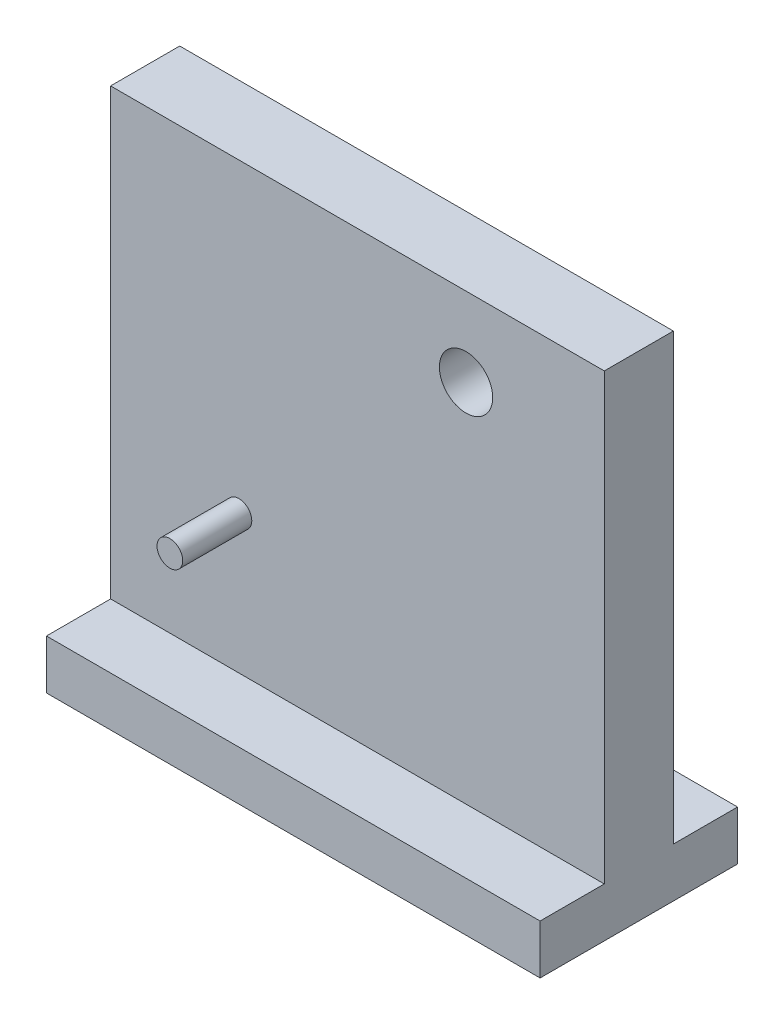
ISO-10303-21;
HEADER;
FILE_DESCRIPTION(('STEP AP214'),'2;1');
FILE_NAME('part.step','',(''),(''),'','','');
FILE_SCHEMA(('AUTOMOTIVE_DESIGN { 1 0 10303 214 1 1 1 1 }'));
ENDSEC;
DATA;
#1=APPLICATION_CONTEXT('core data for automotive mechanical design processes');
#2=APPLICATION_PROTOCOL_DEFINITION('international standard','automotive_design',2000,#1);
#3=PRODUCT_CONTEXT('',#1,'mechanical');
#4=PRODUCT('Part','Part','',(#3));
#5=PRODUCT_RELATED_PRODUCT_CATEGORY('part','',(#4));
#6=PRODUCT_DEFINITION_FORMATION('','',#4);
#7=PRODUCT_DEFINITION_CONTEXT('part definition',#1,'design');
#8=PRODUCT_DEFINITION('design','',#6,#7);
#9=PRODUCT_DEFINITION_SHAPE('','',#8);
#10=(LENGTH_UNIT() NAMED_UNIT(*) SI_UNIT(.MILLI.,.METRE.));
#11=(NAMED_UNIT(*) PLANE_ANGLE_UNIT() SI_UNIT($,.RADIAN.));
#12=(NAMED_UNIT(*) SI_UNIT($,.STERADIAN.) SOLID_ANGLE_UNIT());
#13=UNCERTAINTY_MEASURE_WITH_UNIT(LENGTH_MEASURE(1.E-05),#10,'distance_accuracy_value','');
#14=(GEOMETRIC_REPRESENTATION_CONTEXT(3) GLOBAL_UNCERTAINTY_ASSIGNED_CONTEXT((#13)) GLOBAL_UNIT_ASSIGNED_CONTEXT((#10,
#11,#12)) REPRESENTATION_CONTEXT('',''));
#15=CARTESIAN_POINT('',(0.,0.,0.));
#16=DIRECTION('',(0.,0.,1.));
#17=DIRECTION('',(1.,0.,0.));
#18=AXIS2_PLACEMENT_3D('',#15,#16,#17);
#19=CARTESIAN_POINT('',(0.,0.,3.5));
#20=DIRECTION('',(0.,0.,1.));
#21=DIRECTION('',(1.,0.,0.));
#22=AXIS2_PLACEMENT_3D('',#19,#20,#21);
#23=PLANE('',#22);
#24=CARTESIAN_POINT('',(-17.,19.,3.5));
#25=DIRECTION('',(0.,0.,1.));
#26=DIRECTION('',(1.,0.,0.));
#27=AXIS2_PLACEMENT_3D('',#24,#25,#26);
#28=CIRCLE('',#27,1.3);
#29=CARTESIAN_POINT('',(-15.7,19.,3.5));
#30=VERTEX_POINT('',#29);
#31=EDGE_CURVE('E134',#30,#30,#28,.T.);
#32=ORIENTED_EDGE('',*,*,#31,.F.);
#33=EDGE_LOOP('',(#32));
#34=FACE_BOUND('',#33,.T.);
#35=CARTESIAN_POINT('',(5.99999999999999,42.,3.5));
#36=DIRECTION('',(0.,0.,1.));
#37=DIRECTION('',(1.,0.,0.));
#38=AXIS2_PLACEMENT_3D('',#35,#36,#37);
#39=CIRCLE('',#38,2.7);
#40=CARTESIAN_POINT('',(8.69999999999999,42.,3.5));
#41=VERTEX_POINT('',#40);
#42=EDGE_CURVE('E167',#41,#41,#39,.T.);
#43=ORIENTED_EDGE('',*,*,#42,.F.);
#44=EDGE_LOOP('',(#43));
#45=FACE_BOUND('',#44,.T.);
#46=DIRECTION('',(-1.,0.,0.));
#47=VECTOR('',#46,1.);
#48=CARTESIAN_POINT('',(-20.,50.,3.5));
#49=LINE('',#48,#47);
#50=CARTESIAN_POINT('',(20.,50.,3.5));
#51=VERTEX_POINT('',#50);
#52=CARTESIAN_POINT('',(-30.,50.,3.5));
#53=VERTEX_POINT('',#52);
#54=EDGE_CURVE('E174',#51,#53,#49,.T.);
#55=ORIENTED_EDGE('',*,*,#54,.T.);
#56=DIRECTION('',(0.,1.,0.));
#57=VECTOR('',#56,1.);
#58=CARTESIAN_POINT('',(-30.,5.,3.5));
#59=LINE('',#58,#57);
#60=CARTESIAN_POINT('',(-30.,5.,3.5));
#61=VERTEX_POINT('',#60);
#62=EDGE_CURVE('E142',#61,#53,#59,.T.);
#63=ORIENTED_EDGE('',*,*,#62,.F.);
#64=DIRECTION('',(1.,0.,0.));
#65=VECTOR('',#64,1.);
#66=CARTESIAN_POINT('',(0.,5.,3.5));
#67=LINE('',#66,#65);
#68=CARTESIAN_POINT('',(20.,5.,3.5));
#69=VERTEX_POINT('',#68);
#70=EDGE_CURVE('E164',#61,#69,#67,.T.);
#71=ORIENTED_EDGE('',*,*,#70,.T.);
#72=DIRECTION('',(0.,1.,0.));
#73=VECTOR('',#72,1.);
#74=CARTESIAN_POINT('',(20.,50.,3.5));
#75=LINE('',#74,#73);
#76=EDGE_CURVE('E62',#69,#51,#75,.T.);
#77=ORIENTED_EDGE('',*,*,#76,.T.);
#78=EDGE_LOOP('',(#55,#63,#71,#77));
#79=FACE_BOUND('',#78,.T.);
#80=ADVANCED_FACE('F39',(#34,#45,#79),#23,.T.);
#81=CARTESIAN_POINT('',(0.,0.,-3.5));
#82=DIRECTION('',(0.,0.,1.));
#83=DIRECTION('',(1.,0.,0.));
#84=AXIS2_PLACEMENT_3D('',#81,#82,#83);
#85=PLANE('',#84);
#86=CARTESIAN_POINT('',(5.99999999999999,42.,-3.5));
#87=DIRECTION('',(0.,0.,1.));
#88=DIRECTION('',(1.,0.,0.));
#89=AXIS2_PLACEMENT_3D('',#86,#87,#88);
#90=CIRCLE('',#89,2.7);
#91=CARTESIAN_POINT('',(8.69999999999999,42.,-3.5));
#92=VERTEX_POINT('',#91);
#93=EDGE_CURVE('E166',#92,#92,#90,.T.);
#94=ORIENTED_EDGE('',*,*,#93,.T.);
#95=EDGE_LOOP('',(#94));
#96=FACE_BOUND('',#95,.T.);
#97=DIRECTION('',(1.,0.,0.));
#98=VECTOR('',#97,1.);
#99=CARTESIAN_POINT('',(0.,5.,-3.5));
#100=LINE('',#99,#98);
#101=CARTESIAN_POINT('',(-30.,5.,-3.5));
#102=VERTEX_POINT('',#101);
#103=CARTESIAN_POINT('',(20.,5.,-3.5));
#104=VERTEX_POINT('',#103);
#105=EDGE_CURVE('E161',#102,#104,#100,.T.);
#106=ORIENTED_EDGE('',*,*,#105,.F.);
#107=DIRECTION('',(0.,-1.,0.));
#108=VECTOR('',#107,1.);
#109=CARTESIAN_POINT('',(-30.,50.,-3.5));
#110=LINE('',#109,#108);
#111=CARTESIAN_POINT('',(-30.,50.,-3.5));
#112=VERTEX_POINT('',#111);
#113=EDGE_CURVE('E148',#112,#102,#110,.T.);
#114=ORIENTED_EDGE('',*,*,#113,.F.);
#115=DIRECTION('',(-1.,0.,0.));
#116=VECTOR('',#115,1.);
#117=CARTESIAN_POINT('',(-20.,50.,-3.5));
#118=LINE('',#117,#116);
#119=CARTESIAN_POINT('',(20.,50.,-3.5));
#120=VERTEX_POINT('',#119);
#121=EDGE_CURVE('E175',#120,#112,#118,.T.);
#122=ORIENTED_EDGE('',*,*,#121,.F.);
#123=DIRECTION('',(0.,1.,0.));
#124=VECTOR('',#123,1.);
#125=CARTESIAN_POINT('',(20.,50.,-3.5));
#126=LINE('',#125,#124);
#127=EDGE_CURVE('E170',#104,#120,#126,.T.);
#128=ORIENTED_EDGE('',*,*,#127,.F.);
#129=EDGE_LOOP('',(#106,#114,#122,#128));
#130=FACE_BOUND('',#129,.T.);
#131=ADVANCED_FACE('F193',(#96,#130),#85,.F.);
#132=CARTESIAN_POINT('',(20.,50.,3.5));
#133=DIRECTION('',(-1.,0.,0.));
#134=DIRECTION('',(0.,-1.,0.));
#135=AXIS2_PLACEMENT_3D('',#132,#133,#134);
#136=PLANE('',#135);
#137=DIRECTION('',(0.,0.,-1.));
#138=VECTOR('',#137,1.);
#139=CARTESIAN_POINT('',(20.,0.,3.5));
#140=LINE('',#139,#138);
#141=CARTESIAN_POINT('',(20.,0.,10.));
#142=VERTEX_POINT('',#141);
#143=CARTESIAN_POINT('',(20.,0.,-10.));
#144=VERTEX_POINT('',#143);
#145=EDGE_CURVE('E47',#142,#144,#140,.T.);
#146=ORIENTED_EDGE('',*,*,#145,.T.);
#147=DIRECTION('',(0.,1.,0.));
#148=VECTOR('',#147,1.);
#149=CARTESIAN_POINT('',(20.,0.,-10.));
#150=LINE('',#149,#148);
#151=CARTESIAN_POINT('',(20.,5.,-10.));
#152=VERTEX_POINT('',#151);
#153=EDGE_CURVE('E113',#144,#152,#150,.T.);
#154=ORIENTED_EDGE('',*,*,#153,.T.);
#155=DIRECTION('',(0.,0.,-1.));
#156=VECTOR('',#155,1.);
#157=CARTESIAN_POINT('',(20.,5.,10.));
#158=LINE('',#157,#156);
#159=EDGE_CURVE('E156',#104,#152,#158,.T.);
#160=ORIENTED_EDGE('',*,*,#159,.F.);
#161=ORIENTED_EDGE('',*,*,#127,.T.);
#162=DIRECTION('',(0.,0.,-1.));
#163=VECTOR('',#162,1.);
#164=CARTESIAN_POINT('',(20.,50.,3.5));
#165=LINE('',#164,#163);
#166=EDGE_CURVE('E11',#51,#120,#165,.T.);
#167=ORIENTED_EDGE('',*,*,#166,.F.);
#168=ORIENTED_EDGE('',*,*,#76,.F.);
#169=CARTESIAN_POINT('',(20.,5.,10.));
#170=VERTEX_POINT('',#169);
#171=EDGE_CURVE('E54',#170,#69,#158,.T.);
#172=ORIENTED_EDGE('',*,*,#171,.F.);
#173=DIRECTION('',(0.,1.,0.));
#174=VECTOR('',#173,1.);
#175=CARTESIAN_POINT('',(20.,0.,10.));
#176=LINE('',#175,#174);
#177=EDGE_CURVE('E152',#142,#170,#176,.T.);
#178=ORIENTED_EDGE('',*,*,#177,.F.);
#179=EDGE_LOOP('',(#146,#154,#160,#161,#167,#168,#172,#178));
#180=FACE_BOUND('',#179,.T.);
#181=ADVANCED_FACE('F41',(#180),#136,.F.);
#182=CARTESIAN_POINT('',(-20.,50.,3.5));
#183=DIRECTION('',(0.,-1.,0.));
#184=DIRECTION('',(0.,0.,-1.));
#185=AXIS2_PLACEMENT_3D('',#182,#183,#184);
#186=PLANE('',#185);
#187=ORIENTED_EDGE('',*,*,#121,.T.);
#188=DIRECTION('',(0.,0.,-1.));
#189=VECTOR('',#188,1.);
#190=CARTESIAN_POINT('',(-30.,50.,3.5));
#191=LINE('',#190,#189);
#192=EDGE_CURVE('E145',#53,#112,#191,.T.);
#193=ORIENTED_EDGE('',*,*,#192,.F.);
#194=ORIENTED_EDGE('',*,*,#54,.F.);
#195=ORIENTED_EDGE('',*,*,#166,.T.);
#196=EDGE_LOOP('',(#187,#193,#194,#195));
#197=FACE_BOUND('',#196,.T.);
#198=ADVANCED_FACE('F189',(#197),#186,.F.);
#199=CARTESIAN_POINT('',(-20.,0.,3.5));
#200=DIRECTION('',(0.,1.,0.));
#201=DIRECTION('',(0.,0.,1.));
#202=AXIS2_PLACEMENT_3D('',#199,#200,#201);
#203=PLANE('',#202);
#204=DIRECTION('',(1.,0.,0.));
#205=VECTOR('',#204,1.);
#206=CARTESIAN_POINT('',(-20.,0.,10.));
#207=LINE('',#206,#205);
#208=CARTESIAN_POINT('',(-30.,0.,10.));
#209=VERTEX_POINT('',#208);
#210=EDGE_CURVE('E121',#209,#142,#207,.T.);
#211=ORIENTED_EDGE('',*,*,#210,.F.);
#212=DIRECTION('',(0.,0.,1.));
#213=VECTOR('',#212,1.);
#214=CARTESIAN_POINT('',(-30.,0.,-10.));
#215=LINE('',#214,#213);
#216=CARTESIAN_POINT('',(-30.,0.,-10.));
#217=VERTEX_POINT('',#216);
#218=EDGE_CURVE('E118',#217,#209,#215,.T.);
#219=ORIENTED_EDGE('',*,*,#218,.F.);
#220=DIRECTION('',(1.,0.,0.));
#221=VECTOR('',#220,1.);
#222=CARTESIAN_POINT('',(-20.,0.,-10.));
#223=LINE('',#222,#221);
#224=EDGE_CURVE('E106',#217,#144,#223,.T.);
#225=ORIENTED_EDGE('',*,*,#224,.T.);
#226=ORIENTED_EDGE('',*,*,#145,.F.);
#227=EDGE_LOOP('',(#211,#219,#225,#226));
#228=FACE_BOUND('',#227,.T.);
#229=ADVANCED_FACE('F119',(#228),#203,.F.);
#230=CARTESIAN_POINT('',(5.99999999999999,42.,3.5));
#231=DIRECTION('',(0.,0.,-1.));
#232=DIRECTION('',(-1.,0.,0.));
#233=AXIS2_PLACEMENT_3D('',#230,#231,#232);
#234=CYLINDRICAL_SURFACE('',#233,2.7);
#235=ORIENTED_EDGE('',*,*,#42,.T.);
#236=EDGE_LOOP('',(#235));
#237=FACE_BOUND('',#236,.T.);
#238=ORIENTED_EDGE('',*,*,#93,.F.);
#239=EDGE_LOOP('',(#238));
#240=FACE_BOUND('',#239,.T.);
#241=ADVANCED_FACE('F202',(#237,#240),#234,.F.);
#242=CARTESIAN_POINT('',(0.,0.,-10.));
#243=DIRECTION('',(0.,0.,-1.));
#244=DIRECTION('',(-1.,0.,0.));
#245=AXIS2_PLACEMENT_3D('',#242,#243,#244);
#246=PLANE('',#245);
#247=ORIENTED_EDGE('',*,*,#224,.F.);
#248=DIRECTION('',(0.,-1.,0.));
#249=VECTOR('',#248,1.);
#250=CARTESIAN_POINT('',(-30.,5.,-10.));
#251=LINE('',#250,#249);
#252=CARTESIAN_POINT('',(-30.,5.,-10.));
#253=VERTEX_POINT('',#252);
#254=EDGE_CURVE('E111',#253,#217,#251,.T.);
#255=ORIENTED_EDGE('',*,*,#254,.F.);
#256=DIRECTION('',(-1.,0.,0.));
#257=VECTOR('',#256,1.);
#258=CARTESIAN_POINT('',(-20.,5.,-10.));
#259=LINE('',#258,#257);
#260=EDGE_CURVE('E153',#152,#253,#259,.T.);
#261=ORIENTED_EDGE('',*,*,#260,.F.);
#262=ORIENTED_EDGE('',*,*,#153,.F.);
#263=EDGE_LOOP('',(#247,#255,#261,#262));
#264=FACE_BOUND('',#263,.T.);
#265=ADVANCED_FACE('F108',(#264),#246,.T.);
#266=CARTESIAN_POINT('',(-20.,5.,10.));
#267=DIRECTION('',(0.,-1.,0.));
#268=DIRECTION('',(0.,0.,-1.));
#269=AXIS2_PLACEMENT_3D('',#266,#267,#268);
#270=PLANE('',#269);
#271=ORIENTED_EDGE('',*,*,#260,.T.);
#272=DIRECTION('',(0.,0.,-1.));
#273=VECTOR('',#272,1.);
#274=CARTESIAN_POINT('',(-30.,5.,-3.5));
#275=LINE('',#274,#273);
#276=EDGE_CURVE('E115',#102,#253,#275,.T.);
#277=ORIENTED_EDGE('',*,*,#276,.F.);
#278=ORIENTED_EDGE('',*,*,#105,.T.);
#279=ORIENTED_EDGE('',*,*,#159,.T.);
#280=EDGE_LOOP('',(#271,#277,#278,#279));
#281=FACE_BOUND('',#280,.T.);
#282=ADVANCED_FACE('F195',(#281),#270,.F.);
#283=ORIENTED_EDGE('',*,*,#70,.F.);
#284=DIRECTION('',(0.,0.,-1.));
#285=VECTOR('',#284,1.);
#286=CARTESIAN_POINT('',(-30.,5.,10.));
#287=LINE('',#286,#285);
#288=CARTESIAN_POINT('',(-30.,5.,10.));
#289=VERTEX_POINT('',#288);
#290=EDGE_CURVE('E139',#289,#61,#287,.T.);
#291=ORIENTED_EDGE('',*,*,#290,.F.);
#292=DIRECTION('',(-1.,0.,0.));
#293=VECTOR('',#292,1.);
#294=CARTESIAN_POINT('',(-20.,5.,10.));
#295=LINE('',#294,#293);
#296=EDGE_CURVE('E155',#170,#289,#295,.T.);
#297=ORIENTED_EDGE('',*,*,#296,.F.);
#298=ORIENTED_EDGE('',*,*,#171,.T.);
#299=EDGE_LOOP('',(#283,#291,#297,#298));
#300=FACE_BOUND('',#299,.T.);
#301=ADVANCED_FACE('F185',(#300),#270,.F.);
#302=CARTESIAN_POINT('',(0.,0.,10.));
#303=DIRECTION('',(0.,0.,-1.));
#304=DIRECTION('',(-1.,0.,0.));
#305=AXIS2_PLACEMENT_3D('',#302,#303,#304);
#306=PLANE('',#305);
#307=ORIENTED_EDGE('',*,*,#296,.T.);
#308=DIRECTION('',(0.,1.,0.));
#309=VECTOR('',#308,1.);
#310=CARTESIAN_POINT('',(-30.,0.,10.));
#311=LINE('',#310,#309);
#312=EDGE_CURVE('E125',#209,#289,#311,.T.);
#313=ORIENTED_EDGE('',*,*,#312,.F.);
#314=ORIENTED_EDGE('',*,*,#210,.T.);
#315=ORIENTED_EDGE('',*,*,#177,.T.);
#316=EDGE_LOOP('',(#307,#313,#314,#315));
#317=FACE_BOUND('',#316,.T.);
#318=ADVANCED_FACE('F182',(#317),#306,.F.);
#319=CARTESIAN_POINT('',(-30.,0.,0.));
#320=DIRECTION('',(-1.,0.,0.));
#321=DIRECTION('',(0.,0.,1.));
#322=AXIS2_PLACEMENT_3D('',#319,#320,#321);
#323=PLANE('',#322);
#324=ORIENTED_EDGE('',*,*,#254,.T.);
#325=ORIENTED_EDGE('',*,*,#218,.T.);
#326=ORIENTED_EDGE('',*,*,#312,.T.);
#327=ORIENTED_EDGE('',*,*,#290,.T.);
#328=ORIENTED_EDGE('',*,*,#62,.T.);
#329=ORIENTED_EDGE('',*,*,#192,.T.);
#330=ORIENTED_EDGE('',*,*,#113,.T.);
#331=ORIENTED_EDGE('',*,*,#276,.T.);
#332=EDGE_LOOP('',(#324,#325,#326,#327,#328,#329,#330,#331));
#333=FACE_BOUND('',#332,.T.);
#334=ADVANCED_FACE('F128',(#333),#323,.T.);
#335=CARTESIAN_POINT('',(-17.,19.,10.5));
#336=DIRECTION('',(0.,0.,-1.));
#337=DIRECTION('',(-1.,0.,0.));
#338=AXIS2_PLACEMENT_3D('',#335,#336,#337);
#339=CYLINDRICAL_SURFACE('',#338,1.3);
#340=CARTESIAN_POINT('',(-17.,19.,10.5));
#341=DIRECTION('',(0.,0.,1.));
#342=DIRECTION('',(1.,0.,0.));
#343=AXIS2_PLACEMENT_3D('',#340,#341,#342);
#344=CIRCLE('',#343,1.3);
#345=CARTESIAN_POINT('',(-15.7,19.,10.5));
#346=VERTEX_POINT('',#345);
#347=EDGE_CURVE('E131',#346,#346,#344,.T.);
#348=ORIENTED_EDGE('',*,*,#347,.F.);
#349=EDGE_LOOP('',(#348));
#350=FACE_BOUND('',#349,.T.);
#351=ORIENTED_EDGE('',*,*,#31,.T.);
#352=EDGE_LOOP('',(#351));
#353=FACE_BOUND('',#352,.T.);
#354=ADVANCED_FACE('F294',(#350,#353),#339,.T.);
#355=CARTESIAN_POINT('',(-17.,19.,10.5));
#356=DIRECTION('',(0.,0.,1.));
#357=DIRECTION('',(1.,0.,0.));
#358=AXIS2_PLACEMENT_3D('',#355,#356,#357);
#359=PLANE('',#358);
#360=ORIENTED_EDGE('',*,*,#347,.T.);
#361=EDGE_LOOP('',(#360));
#362=FACE_BOUND('',#361,.T.);
#363=ADVANCED_FACE('F302',(#362),#359,.T.);
#364=CLOSED_SHELL('',(#80,#131,#181,#198,#229,#241,#265,#282,#301,#318,#334,#354,#363));
#365=MANIFOLD_SOLID_BREP('B2',#364);
#366=ADVANCED_BREP_SHAPE_REPRESENTATION('',(#18,#365),#14);
#367=SHAPE_DEFINITION_REPRESENTATION(#9,#366);
ENDSEC;
END-ISO-10303-21;
